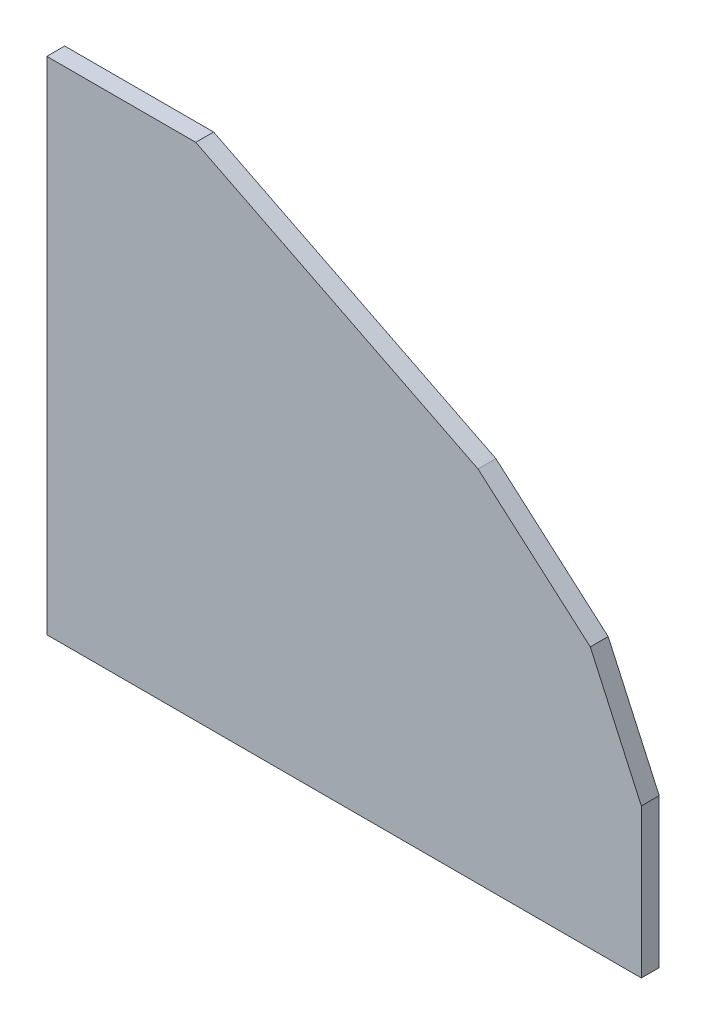
ISO-10303-21;
HEADER;
FILE_DESCRIPTION(('STEP AP214'),'2;1');
FILE_NAME('part.step','',(''),(''),'','','');
FILE_SCHEMA(('AUTOMOTIVE_DESIGN { 1 0 10303 214 1 1 1 1 }'));
ENDSEC;
DATA;
#1=APPLICATION_CONTEXT('core data for automotive mechanical design processes');
#2=APPLICATION_PROTOCOL_DEFINITION('international standard','automotive_design',2000,#1);
#3=PRODUCT_CONTEXT('',#1,'mechanical');
#4=PRODUCT('Part','Part','',(#3));
#5=PRODUCT_RELATED_PRODUCT_CATEGORY('part','',(#4));
#6=PRODUCT_DEFINITION_FORMATION('','',#4);
#7=PRODUCT_DEFINITION_CONTEXT('part definition',#1,'design');
#8=PRODUCT_DEFINITION('design','',#6,#7);
#9=PRODUCT_DEFINITION_SHAPE('','',#8);
#10=(LENGTH_UNIT() NAMED_UNIT(*) SI_UNIT(.MILLI.,.METRE.));
#11=(NAMED_UNIT(*) PLANE_ANGLE_UNIT() SI_UNIT($,.RADIAN.));
#12=(NAMED_UNIT(*) SI_UNIT($,.STERADIAN.) SOLID_ANGLE_UNIT());
#13=UNCERTAINTY_MEASURE_WITH_UNIT(LENGTH_MEASURE(1.E-05),#10,'distance_accuracy_value','');
#14=(GEOMETRIC_REPRESENTATION_CONTEXT(3) GLOBAL_UNCERTAINTY_ASSIGNED_CONTEXT((#13)) GLOBAL_UNIT_ASSIGNED_CONTEXT((#10,
#11,#12)) REPRESENTATION_CONTEXT('',''));
#15=CARTESIAN_POINT('',(0.,0.,0.));
#16=DIRECTION('',(0.,0.,1.));
#17=DIRECTION('',(1.,0.,0.));
#18=AXIS2_PLACEMENT_3D('',#15,#16,#17);
#19=CARTESIAN_POINT('',(249.538430592097,100.,-6.));
#20=DIRECTION('',(1.,0.,0.));
#21=DIRECTION('',(0.,0.,-1.));
#22=AXIS2_PLACEMENT_3D('',#19,#20,#21);
#23=PLANE('',#22);
#24=DIRECTION('',(0.,1.,0.));
#25=VECTOR('',#24,1.);
#26=CARTESIAN_POINT('',(249.538430592097,100.,0.));
#27=LINE('',#26,#25);
#28=CARTESIAN_POINT('',(249.538430592097,49.9999999999998,0.));
#29=VERTEX_POINT('',#28);
#30=CARTESIAN_POINT('',(249.538430592097,100.,0.));
#31=VERTEX_POINT('',#30);
#32=EDGE_CURVE('E127',#29,#31,#27,.T.);
#33=ORIENTED_EDGE('',*,*,#32,.F.);
#34=DIRECTION('',(0.,0.,1.));
#35=VECTOR('',#34,1.);
#36=CARTESIAN_POINT('',(249.538430592097,49.9999999999998,-6.));
#37=LINE('',#36,#35);
#38=CARTESIAN_POINT('',(249.538430592097,49.9999999999998,-6.));
#39=VERTEX_POINT('',#38);
#40=EDGE_CURVE('E11',#39,#29,#37,.T.);
#41=ORIENTED_EDGE('',*,*,#40,.F.);
#42=DIRECTION('',(0.,1.,0.));
#43=VECTOR('',#42,1.);
#44=CARTESIAN_POINT('',(249.538430592097,100.,-6.));
#45=LINE('',#44,#43);
#46=CARTESIAN_POINT('',(249.538430592097,100.,-6.));
#47=VERTEX_POINT('',#46);
#48=EDGE_CURVE('E144',#39,#47,#45,.T.);
#49=ORIENTED_EDGE('',*,*,#48,.T.);
#50=DIRECTION('',(0.,0.,1.));
#51=VECTOR('',#50,1.);
#52=CARTESIAN_POINT('',(249.538430592097,100.,-6.));
#53=LINE('',#52,#51);
#54=EDGE_CURVE('E39',#47,#31,#53,.T.);
#55=ORIENTED_EDGE('',*,*,#54,.T.);
#56=EDGE_LOOP('',(#33,#41,#49,#55));
#57=FACE_BOUND('',#56,.T.);
#58=ADVANCED_FACE('F36',(#57),#23,.T.);
#59=CARTESIAN_POINT('',(249.538430592097,49.9999999999998,-6.));
#60=DIRECTION('',(0.,-1.,0.));
#61=DIRECTION('',(1.,0.,0.));
#62=AXIS2_PLACEMENT_3D('',#59,#60,#61);
#63=PLANE('',#62);
#64=DIRECTION('',(1.,0.,0.));
#65=VECTOR('',#64,1.);
#66=CARTESIAN_POINT('',(249.538430592097,49.9999999999998,0.));
#67=LINE('',#66,#65);
#68=CARTESIAN_POINT('',(49.9999999999994,49.9999999999998,0.));
#69=VERTEX_POINT('',#68);
#70=EDGE_CURVE('E142',#69,#29,#67,.T.);
#71=ORIENTED_EDGE('',*,*,#70,.F.);
#72=DIRECTION('',(0.,0.,1.));
#73=VECTOR('',#72,1.);
#74=CARTESIAN_POINT('',(49.9999999999994,49.9999999999998,-6.));
#75=LINE('',#74,#73);
#76=CARTESIAN_POINT('',(49.9999999999994,49.9999999999998,-6.));
#77=VERTEX_POINT('',#76);
#78=EDGE_CURVE('E45',#77,#69,#75,.T.);
#79=ORIENTED_EDGE('',*,*,#78,.F.);
#80=DIRECTION('',(1.,0.,0.));
#81=VECTOR('',#80,1.);
#82=CARTESIAN_POINT('',(249.538430592097,49.9999999999998,-6.));
#83=LINE('',#82,#81);
#84=EDGE_CURVE('E117',#77,#39,#83,.T.);
#85=ORIENTED_EDGE('',*,*,#84,.T.);
#86=ORIENTED_EDGE('',*,*,#40,.T.);
#87=EDGE_LOOP('',(#71,#79,#85,#86));
#88=FACE_BOUND('',#87,.T.);
#89=ADVANCED_FACE('F154',(#88),#63,.T.);
#90=CARTESIAN_POINT('',(49.9999999999994,49.9999999999998,-6.));
#91=DIRECTION('',(-1.,0.,0.));
#92=DIRECTION('',(0.,-1.,0.));
#93=AXIS2_PLACEMENT_3D('',#90,#91,#92);
#94=PLANE('',#93);
#95=DIRECTION('',(0.,-1.,0.));
#96=VECTOR('',#95,1.);
#97=CARTESIAN_POINT('',(49.9999999999994,49.9999999999998,0.));
#98=LINE('',#97,#96);
#99=CARTESIAN_POINT('',(49.9999999999994,218.119792729516,0.));
#100=VERTEX_POINT('',#99);
#101=EDGE_CURVE('E104',#100,#69,#98,.T.);
#102=ORIENTED_EDGE('',*,*,#101,.F.);
#103=DIRECTION('',(0.,0.,1.));
#104=VECTOR('',#103,1.);
#105=CARTESIAN_POINT('',(49.9999999999994,218.119792729516,-6.));
#106=LINE('',#105,#104);
#107=CARTESIAN_POINT('',(49.9999999999994,218.119792729516,-6.));
#108=VERTEX_POINT('',#107);
#109=EDGE_CURVE('E99',#108,#100,#106,.T.);
#110=ORIENTED_EDGE('',*,*,#109,.F.);
#111=DIRECTION('',(0.,-1.,0.));
#112=VECTOR('',#111,1.);
#113=CARTESIAN_POINT('',(49.9999999999994,49.9999999999998,-6.));
#114=LINE('',#113,#112);
#115=EDGE_CURVE('E102',#108,#77,#114,.T.);
#116=ORIENTED_EDGE('',*,*,#115,.T.);
#117=ORIENTED_EDGE('',*,*,#78,.T.);
#118=EDGE_LOOP('',(#102,#110,#116,#117));
#119=FACE_BOUND('',#118,.T.);
#120=ADVANCED_FACE('F101',(#119),#94,.T.);
#121=CARTESIAN_POINT('',(49.9999999999994,218.119792729516,-6.));
#122=DIRECTION('',(0.,1.,0.));
#123=DIRECTION('',(0.,0.,1.));
#124=AXIS2_PLACEMENT_3D('',#121,#122,#123);
#125=PLANE('',#124);
#126=DIRECTION('',(-1.,0.,0.));
#127=VECTOR('',#126,1.);
#128=CARTESIAN_POINT('',(49.9999999999994,218.119792729516,0.));
#129=LINE('',#128,#127);
#130=CARTESIAN_POINT('',(100.,218.119792729516,0.));
#131=VERTEX_POINT('',#130);
#132=EDGE_CURVE('E139',#131,#100,#129,.T.);
#133=ORIENTED_EDGE('',*,*,#132,.F.);
#134=DIRECTION('',(0.,0.,1.));
#135=VECTOR('',#134,1.);
#136=CARTESIAN_POINT('',(100.,218.119792729516,-6.));
#137=LINE('',#136,#135);
#138=CARTESIAN_POINT('',(100.,218.119792729516,-6.));
#139=VERTEX_POINT('',#138);
#140=EDGE_CURVE('E109',#139,#131,#137,.T.);
#141=ORIENTED_EDGE('',*,*,#140,.F.);
#142=DIRECTION('',(-1.,0.,0.));
#143=VECTOR('',#142,1.);
#144=CARTESIAN_POINT('',(49.9999999999994,218.119792729516,-6.));
#145=LINE('',#144,#143);
#146=EDGE_CURVE('E115',#139,#108,#145,.T.);
#147=ORIENTED_EDGE('',*,*,#146,.T.);
#148=ORIENTED_EDGE('',*,*,#109,.T.);
#149=EDGE_LOOP('',(#133,#141,#147,#148));
#150=FACE_BOUND('',#149,.T.);
#151=ADVANCED_FACE('F119',(#150),#125,.T.);
#152=CARTESIAN_POINT('',(100.,218.119792729516,-6.));
#153=DIRECTION('',(0.44874584854752,0.893659422493472,0.));
#154=DIRECTION('',(-0.893659422493472,0.44874584854752,0.));
#155=AXIS2_PLACEMENT_3D('',#152,#153,#154);
#156=PLANE('',#155);
#157=DIRECTION('',(-0.893659422493472,0.44874584854752,0.));
#158=VECTOR('',#157,1.);
#159=CARTESIAN_POINT('',(100.,218.119792729516,0.));
#160=LINE('',#159,#158);
#161=CARTESIAN_POINT('',(194.738205570518,170.547557291108,0.));
#162=VERTEX_POINT('',#161);
#163=EDGE_CURVE('E136',#162,#131,#160,.T.);
#164=ORIENTED_EDGE('',*,*,#163,.F.);
#165=DIRECTION('',(0.,0.,1.));
#166=VECTOR('',#165,1.);
#167=CARTESIAN_POINT('',(194.738205570518,170.547557291108,-6.));
#168=LINE('',#167,#166);
#169=CARTESIAN_POINT('',(194.738205570518,170.547557291108,-6.));
#170=VERTEX_POINT('',#169);
#171=EDGE_CURVE('E148',#170,#162,#168,.T.);
#172=ORIENTED_EDGE('',*,*,#171,.F.);
#173=DIRECTION('',(-0.893659422493472,0.44874584854752,0.));
#174=VECTOR('',#173,1.);
#175=CARTESIAN_POINT('',(100.,218.119792729516,-6.));
#176=LINE('',#175,#174);
#177=EDGE_CURVE('E120',#170,#139,#176,.T.);
#178=ORIENTED_EDGE('',*,*,#177,.T.);
#179=ORIENTED_EDGE('',*,*,#140,.T.);
#180=EDGE_LOOP('',(#164,#172,#178,#179));
#181=FACE_BOUND('',#180,.T.);
#182=ADVANCED_FACE('F167',(#181),#156,.T.);
#183=CARTESIAN_POINT('',(194.738205570518,170.547557291108,-6.));
#184=DIRECTION('',(0.657473322695292,0.753477823126874,0.));
#185=DIRECTION('',(-0.753477823126874,0.657473322695292,0.));
#186=AXIS2_PLACEMENT_3D('',#183,#184,#185);
#187=PLANE('',#186);
#188=DIRECTION('',(-0.753477823126874,0.657473322695292,0.));
#189=VECTOR('',#188,1.);
#190=CARTESIAN_POINT('',(194.738205570518,170.547557291108,0.));
#191=LINE('',#190,#189);
#192=CARTESIAN_POINT('',(232.412096726861,137.673891156343,0.));
#193=VERTEX_POINT('',#192);
#194=EDGE_CURVE('E133',#193,#162,#191,.T.);
#195=ORIENTED_EDGE('',*,*,#194,.F.);
#196=DIRECTION('',(0.,0.,1.));
#197=VECTOR('',#196,1.);
#198=CARTESIAN_POINT('',(232.412096726861,137.673891156343,-6.));
#199=LINE('',#198,#197);
#200=CARTESIAN_POINT('',(232.412096726861,137.673891156343,-6.));
#201=VERTEX_POINT('',#200);
#202=EDGE_CURVE('E149',#201,#193,#199,.T.);
#203=ORIENTED_EDGE('',*,*,#202,.F.);
#204=DIRECTION('',(-0.753477823126874,0.657473322695292,0.));
#205=VECTOR('',#204,1.);
#206=CARTESIAN_POINT('',(194.738205570518,170.547557291108,-6.));
#207=LINE('',#206,#205);
#208=EDGE_CURVE('E122',#201,#170,#207,.T.);
#209=ORIENTED_EDGE('',*,*,#208,.T.);
#210=ORIENTED_EDGE('',*,*,#171,.T.);
#211=EDGE_LOOP('',(#195,#203,#209,#210));
#212=FACE_BOUND('',#211,.T.);
#213=ADVANCED_FACE('F170',(#212),#187,.T.);
#214=CARTESIAN_POINT('',(232.412096726861,137.673891156343,-6.));
#215=DIRECTION('',(0.910349746716966,0.413839749966525,0.));
#216=DIRECTION('',(-0.413839749966525,0.910349746716966,0.));
#217=AXIS2_PLACEMENT_3D('',#214,#215,#216);
#218=PLANE('',#217);
#219=DIRECTION('',(-0.413839749966525,0.910349746716966,0.));
#220=VECTOR('',#219,1.);
#221=CARTESIAN_POINT('',(232.412096726861,137.673891156343,0.));
#222=LINE('',#221,#220);
#223=EDGE_CURVE('E130',#31,#193,#222,.T.);
#224=ORIENTED_EDGE('',*,*,#223,.F.);
#225=ORIENTED_EDGE('',*,*,#54,.F.);
#226=DIRECTION('',(-0.413839749966525,0.910349746716966,0.));
#227=VECTOR('',#226,1.);
#228=CARTESIAN_POINT('',(232.412096726861,137.673891156343,-6.));
#229=LINE('',#228,#227);
#230=EDGE_CURVE('E250',#47,#201,#229,.T.);
#231=ORIENTED_EDGE('',*,*,#230,.T.);
#232=ORIENTED_EDGE('',*,*,#202,.T.);
#233=EDGE_LOOP('',(#224,#225,#231,#232));
#234=FACE_BOUND('',#233,.T.);
#235=ADVANCED_FACE('F151',(#234),#218,.T.);
#236=CARTESIAN_POINT('',(0.,0.,-6.));
#237=DIRECTION('',(0.,0.,-1.));
#238=DIRECTION('',(-1.,0.,0.));
#239=AXIS2_PLACEMENT_3D('',#236,#237,#238);
#240=PLANE('',#239);
#241=ORIENTED_EDGE('',*,*,#48,.F.);
#242=ORIENTED_EDGE('',*,*,#84,.F.);
#243=ORIENTED_EDGE('',*,*,#115,.F.);
#244=ORIENTED_EDGE('',*,*,#146,.F.);
#245=ORIENTED_EDGE('',*,*,#177,.F.);
#246=ORIENTED_EDGE('',*,*,#208,.F.);
#247=ORIENTED_EDGE('',*,*,#230,.F.);
#248=EDGE_LOOP('',(#241,#242,#243,#244,#245,#246,#247));
#249=FACE_BOUND('',#248,.T.);
#250=ADVANCED_FACE('F113',(#249),#240,.T.);
#251=CARTESIAN_POINT('',(0.,0.,0.));
#252=DIRECTION('',(0.,0.,-1.));
#253=DIRECTION('',(-1.,0.,0.));
#254=AXIS2_PLACEMENT_3D('',#251,#252,#253);
#255=PLANE('',#254);
#256=ORIENTED_EDGE('',*,*,#32,.T.);
#257=ORIENTED_EDGE('',*,*,#223,.T.);
#258=ORIENTED_EDGE('',*,*,#194,.T.);
#259=ORIENTED_EDGE('',*,*,#163,.T.);
#260=ORIENTED_EDGE('',*,*,#132,.T.);
#261=ORIENTED_EDGE('',*,*,#101,.T.);
#262=ORIENTED_EDGE('',*,*,#70,.T.);
#263=EDGE_LOOP('',(#256,#257,#258,#259,#260,#261,#262));
#264=FACE_BOUND('',#263,.T.);
#265=ADVANCED_FACE('F153',(#264),#255,.F.);
#266=CLOSED_SHELL('',(#58,#89,#120,#151,#182,#213,#235,#250,#265));
#267=MANIFOLD_SOLID_BREP('B2',#266);
#268=ADVANCED_BREP_SHAPE_REPRESENTATION('',(#18,#267),#14);
#269=SHAPE_DEFINITION_REPRESENTATION(#9,#268);
ENDSEC;
END-ISO-10303-21;
